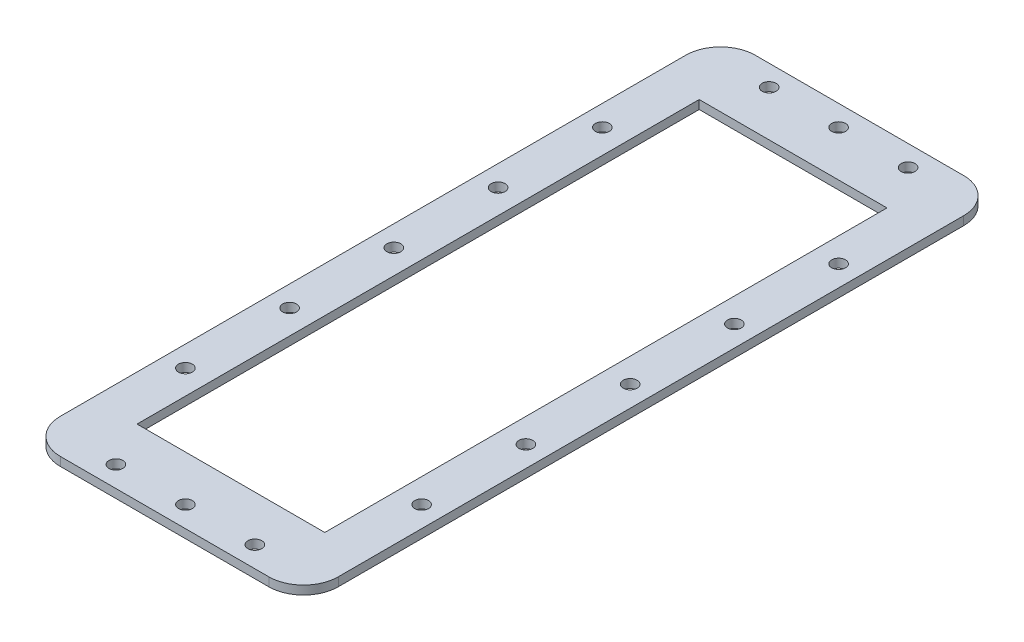
ISO-10303-21;
HEADER;
FILE_DESCRIPTION(('STEP AP214'),'2;1');
FILE_NAME('part.step','',(''),(''),'','','');
FILE_SCHEMA(('AUTOMOTIVE_DESIGN { 1 0 10303 214 1 1 1 1 }'));
ENDSEC;
DATA;
#1=APPLICATION_CONTEXT('core data for automotive mechanical design processes');
#2=APPLICATION_PROTOCOL_DEFINITION('international standard','automotive_design',2000,#1);
#3=PRODUCT_CONTEXT('',#1,'mechanical');
#4=PRODUCT('Part','Part','',(#3));
#5=PRODUCT_RELATED_PRODUCT_CATEGORY('part','',(#4));
#6=PRODUCT_DEFINITION_FORMATION('','',#4);
#7=PRODUCT_DEFINITION_CONTEXT('part definition',#1,'design');
#8=PRODUCT_DEFINITION('design','',#6,#7);
#9=PRODUCT_DEFINITION_SHAPE('','',#8);
#10=(LENGTH_UNIT() NAMED_UNIT(*) SI_UNIT(.MILLI.,.METRE.));
#11=(NAMED_UNIT(*) PLANE_ANGLE_UNIT() SI_UNIT($,.RADIAN.));
#12=(NAMED_UNIT(*) SI_UNIT($,.STERADIAN.) SOLID_ANGLE_UNIT());
#13=UNCERTAINTY_MEASURE_WITH_UNIT(LENGTH_MEASURE(1.E-05),#10,'distance_accuracy_value','');
#14=(GEOMETRIC_REPRESENTATION_CONTEXT(3) GLOBAL_UNCERTAINTY_ASSIGNED_CONTEXT((#13)) GLOBAL_UNIT_ASSIGNED_CONTEXT((#10,
#11,#12)) REPRESENTATION_CONTEXT('',''));
#15=CARTESIAN_POINT('',(0.,0.,0.));
#16=DIRECTION('',(0.,0.,1.));
#17=DIRECTION('',(1.,0.,0.));
#18=AXIS2_PLACEMENT_3D('',#15,#16,#17);
#19=CARTESIAN_POINT('',(-30.6996276411229,3.175,-42.9503076219948));
#20=DIRECTION('',(1.,0.,0.));
#21=DIRECTION('',(0.,0.,-1.));
#22=AXIS2_PLACEMENT_3D('',#19,#20,#21);
#23=PLANE('',#22);
#24=DIRECTION('',(0.,0.,1.));
#25=VECTOR('',#24,1.);
#26=CARTESIAN_POINT('',(-30.6996276411229,0.,-42.9503076219948));
#27=LINE('',#26,#25);
#28=CARTESIAN_POINT('',(-30.6996276411229,0.,-30.2503076219948));
#29=VERTEX_POINT('',#28);
#30=CARTESIAN_POINT('',(-30.6996276411228,0.,198.349692378005));
#31=VERTEX_POINT('',#30);
#32=EDGE_CURVE('E252',#29,#31,#27,.T.);
#33=ORIENTED_EDGE('',*,*,#32,.T.);
#34=DIRECTION('',(0.,-1.,0.));
#35=VECTOR('',#34,1.);
#36=CARTESIAN_POINT('',(-30.6996276411228,3.175,198.349692378005));
#37=LINE('',#36,#35);
#38=CARTESIAN_POINT('',(-30.6996276411228,3.175,198.349692378005));
#39=VERTEX_POINT('',#38);
#40=EDGE_CURVE('E294',#31,#39,#37,.F.);
#41=ORIENTED_EDGE('',*,*,#40,.T.);
#42=DIRECTION('',(0.,0.,1.));
#43=VECTOR('',#42,1.);
#44=CARTESIAN_POINT('',(-30.6996276411229,3.175,-42.9503076219948));
#45=LINE('',#44,#43);
#46=CARTESIAN_POINT('',(-30.6996276411229,3.175,-30.2503076219948));
#47=VERTEX_POINT('',#46);
#48=EDGE_CURVE('E255',#47,#39,#45,.T.);
#49=ORIENTED_EDGE('',*,*,#48,.F.);
#50=DIRECTION('',(0.,-1.,0.));
#51=VECTOR('',#50,1.);
#52=CARTESIAN_POINT('',(-30.6996276411229,3.175,-30.2503076219948));
#53=LINE('',#52,#51);
#54=EDGE_CURVE('E291',#47,#29,#53,.T.);
#55=ORIENTED_EDGE('',*,*,#54,.T.);
#56=EDGE_LOOP('',(#33,#41,#49,#55));
#57=FACE_BOUND('',#56,.T.);
#58=ADVANCED_FACE('F33',(#57),#23,.F.);
#59=CARTESIAN_POINT('',(-30.6996276411228,3.175,211.049692378005));
#60=DIRECTION('',(0.,0.,-1.));
#61=DIRECTION('',(-1.,0.,0.));
#62=AXIS2_PLACEMENT_3D('',#59,#60,#61);
#63=PLANE('',#62);
#64=DIRECTION('',(1.,0.,0.));
#65=VECTOR('',#64,1.);
#66=CARTESIAN_POINT('',(-30.6996276411228,3.175,211.049692378005));
#67=LINE('',#66,#65);
#68=CARTESIAN_POINT('',(-17.9996276411228,3.175,211.049692378005));
#69=VERTEX_POINT('',#68);
#70=CARTESIAN_POINT('',(58.2003723588771,3.175,211.049692378005));
#71=VERTEX_POINT('',#70);
#72=EDGE_CURVE('E258',#69,#71,#67,.T.);
#73=ORIENTED_EDGE('',*,*,#72,.F.);
#74=DIRECTION('',(0.,-1.,0.));
#75=VECTOR('',#74,1.);
#76=CARTESIAN_POINT('',(-17.9996276411228,3.175,211.049692378005));
#77=LINE('',#76,#75);
#78=CARTESIAN_POINT('',(-17.9996276411228,0.,211.049692378005));
#79=VERTEX_POINT('',#78);
#80=EDGE_CURVE('E280',#69,#79,#77,.T.);
#81=ORIENTED_EDGE('',*,*,#80,.T.);
#82=DIRECTION('',(1.,0.,0.));
#83=VECTOR('',#82,1.);
#84=CARTESIAN_POINT('',(-30.6996276411228,0.,211.049692378005));
#85=LINE('',#84,#83);
#86=CARTESIAN_POINT('',(58.2003723588771,0.,211.049692378005));
#87=VERTEX_POINT('',#86);
#88=EDGE_CURVE('E271',#79,#87,#85,.T.);
#89=ORIENTED_EDGE('',*,*,#88,.T.);
#90=DIRECTION('',(0.,-1.,0.));
#91=VECTOR('',#90,1.);
#92=CARTESIAN_POINT('',(58.2003723588771,3.175,211.049692378005));
#93=LINE('',#92,#91);
#94=EDGE_CURVE('E268',#87,#71,#93,.F.);
#95=ORIENTED_EDGE('',*,*,#94,.T.);
#96=EDGE_LOOP('',(#73,#81,#89,#95));
#97=FACE_BOUND('',#96,.T.);
#98=ADVANCED_FACE('F332',(#97),#63,.F.);
#99=CARTESIAN_POINT('',(70.9003723588771,3.175,-42.9503076219948));
#100=DIRECTION('',(-1.,0.,0.));
#101=DIRECTION('',(0.,0.,1.));
#102=AXIS2_PLACEMENT_3D('',#99,#100,#101);
#103=PLANE('',#102);
#104=DIRECTION('',(0.,0.,-1.));
#105=VECTOR('',#104,1.);
#106=CARTESIAN_POINT('',(70.9003723588771,3.175,-42.9503076219948));
#107=LINE('',#106,#105);
#108=CARTESIAN_POINT('',(70.9003723588771,3.175,198.349692378005));
#109=VERTEX_POINT('',#108);
#110=CARTESIAN_POINT('',(70.9003723588771,3.175,-30.2503076219948));
#111=VERTEX_POINT('',#110);
#112=EDGE_CURVE('E262',#109,#111,#107,.T.);
#113=ORIENTED_EDGE('',*,*,#112,.F.);
#114=DIRECTION('',(0.,-1.,0.));
#115=VECTOR('',#114,1.);
#116=CARTESIAN_POINT('',(70.9003723588771,3.175,198.349692378005));
#117=LINE('',#116,#115);
#118=CARTESIAN_POINT('',(70.9003723588771,0.,198.349692378005));
#119=VERTEX_POINT('',#118);
#120=EDGE_CURVE('E306',#109,#119,#117,.T.);
#121=ORIENTED_EDGE('',*,*,#120,.T.);
#122=DIRECTION('',(0.,0.,-1.));
#123=VECTOR('',#122,1.);
#124=CARTESIAN_POINT('',(70.9003723588771,0.,-42.9503076219948));
#125=LINE('',#124,#123);
#126=CARTESIAN_POINT('',(70.9003723588771,0.,-30.2503076219948));
#127=VERTEX_POINT('',#126);
#128=EDGE_CURVE('E274',#119,#127,#125,.T.);
#129=ORIENTED_EDGE('',*,*,#128,.T.);
#130=DIRECTION('',(0.,-1.,0.));
#131=VECTOR('',#130,1.);
#132=CARTESIAN_POINT('',(70.9003723588771,3.175,-30.2503076219948));
#133=LINE('',#132,#131);
#134=EDGE_CURVE('E304',#127,#111,#133,.F.);
#135=ORIENTED_EDGE('',*,*,#134,.T.);
#136=EDGE_LOOP('',(#113,#121,#129,#135));
#137=FACE_BOUND('',#136,.T.);
#138=ADVANCED_FACE('F341',(#137),#103,.F.);
#139=CARTESIAN_POINT('',(-30.6996276411229,3.175,-42.9503076219948));
#140=DIRECTION('',(0.,0.,1.));
#141=DIRECTION('',(1.,0.,0.));
#142=AXIS2_PLACEMENT_3D('',#139,#140,#141);
#143=PLANE('',#142);
#144=DIRECTION('',(-1.,0.,0.));
#145=VECTOR('',#144,1.);
#146=CARTESIAN_POINT('',(-30.6996276411229,3.175,-42.9503076219948));
#147=LINE('',#146,#145);
#148=CARTESIAN_POINT('',(58.2003723588771,3.175,-42.9503076219948));
#149=VERTEX_POINT('',#148);
#150=CARTESIAN_POINT('',(-17.9996276411229,3.175,-42.9503076219948));
#151=VERTEX_POINT('',#150);
#152=EDGE_CURVE('E265',#149,#151,#147,.T.);
#153=ORIENTED_EDGE('',*,*,#152,.F.);
#154=DIRECTION('',(0.,-1.,0.));
#155=VECTOR('',#154,1.);
#156=CARTESIAN_POINT('',(58.2003723588771,3.175,-42.9503076219948));
#157=LINE('',#156,#155);
#158=CARTESIAN_POINT('',(58.2003723588771,0.,-42.9503076219948));
#159=VERTEX_POINT('',#158);
#160=EDGE_CURVE('E11',#149,#159,#157,.T.);
#161=ORIENTED_EDGE('',*,*,#160,.T.);
#162=DIRECTION('',(-1.,0.,0.));
#163=VECTOR('',#162,1.);
#164=CARTESIAN_POINT('',(-30.6996276411229,0.,-42.9503076219948));
#165=LINE('',#164,#163);
#166=CARTESIAN_POINT('',(-17.9996276411229,0.,-42.9503076219948));
#167=VERTEX_POINT('',#166);
#168=EDGE_CURVE('E259',#159,#167,#165,.T.);
#169=ORIENTED_EDGE('',*,*,#168,.T.);
#170=DIRECTION('',(0.,-1.,0.));
#171=VECTOR('',#170,1.);
#172=CARTESIAN_POINT('',(-17.9996276411229,3.175,-42.9503076219948));
#173=LINE('',#172,#171);
#174=EDGE_CURVE('E41',#167,#151,#173,.F.);
#175=ORIENTED_EDGE('',*,*,#174,.T.);
#176=EDGE_LOOP('',(#153,#161,#169,#175));
#177=FACE_BOUND('',#176,.T.);
#178=ADVANCED_FACE('F311',(#177),#143,.F.);
#179=CARTESIAN_POINT('',(0.,3.175,0.));
#180=DIRECTION('',(0.,1.,0.));
#181=DIRECTION('',(0.,0.,1.));
#182=AXIS2_PLACEMENT_3D('',#179,#180,#181);
#183=PLANE('',#182);
#184=DIRECTION('',(0.,0.,-1.));
#185=VECTOR('',#184,1.);
#186=CARTESIAN_POINT('',(54.4160809992935,3.175,-18.6854897672288));
#187=LINE('',#186,#185);
#188=CARTESIAN_POINT('',(54.4160809992935,3.175,186.784874523239));
#189=VERTEX_POINT('',#188);
#190=CARTESIAN_POINT('',(54.4160809992935,3.175,-18.6854897672288));
#191=VERTEX_POINT('',#190);
#192=EDGE_CURVE('E48',#189,#191,#187,.T.);
#193=ORIENTED_EDGE('',*,*,#192,.F.);
#194=DIRECTION('',(1.,0.,0.));
#195=VECTOR('',#194,1.);
#196=CARTESIAN_POINT('',(-14.2153362815392,3.175,186.784874523239));
#197=LINE('',#196,#195);
#198=CARTESIAN_POINT('',(-14.2153362815392,3.175,186.784874523239));
#199=VERTEX_POINT('',#198);
#200=EDGE_CURVE('E140',#199,#189,#197,.T.);
#201=ORIENTED_EDGE('',*,*,#200,.F.);
#202=DIRECTION('',(0.,0.,1.));
#203=VECTOR('',#202,1.);
#204=CARTESIAN_POINT('',(-14.2153362815392,3.175,-18.6854897672288));
#205=LINE('',#204,#203);
#206=CARTESIAN_POINT('',(-14.2153362815392,3.175,-18.6854897672288));
#207=VERTEX_POINT('',#206);
#208=EDGE_CURVE('E143',#207,#199,#205,.T.);
#209=ORIENTED_EDGE('',*,*,#208,.F.);
#210=DIRECTION('',(-1.,0.,0.));
#211=VECTOR('',#210,1.);
#212=CARTESIAN_POINT('',(-14.2153362815392,3.175,-18.6854897672288));
#213=LINE('',#212,#211);
#214=EDGE_CURVE('E149',#191,#207,#213,.T.);
#215=ORIENTED_EDGE('',*,*,#214,.F.);
#216=EDGE_LOOP('',(#193,#201,#209,#215));
#217=FACE_BOUND('',#216,.T.);
#218=CARTESIAN_POINT('',(-5.29962764112285,3.175,203.429692378005));
#219=DIRECTION('',(0.,1.,0.));
#220=DIRECTION('',(0.,0.,-1.));
#221=AXIS2_PLACEMENT_3D('',#218,#219,#220);
#222=CIRCLE('',#221,2.54000000000001);
#223=CARTESIAN_POINT('',(-5.29962764112285,3.175,200.889692378005));
#224=VERTEX_POINT('',#223);
#225=EDGE_CURVE('E155',#224,#224,#222,.T.);
#226=ORIENTED_EDGE('',*,*,#225,.F.);
#227=EDGE_LOOP('',(#226));
#228=FACE_BOUND('',#227,.T.);
#229=CARTESIAN_POINT('',(20.1003723588771,3.175,203.429692378005));
#230=DIRECTION('',(0.,1.,0.));
#231=DIRECTION('',(0.,0.,-1.));
#232=AXIS2_PLACEMENT_3D('',#229,#230,#231);
#233=CIRCLE('',#232,2.54000000000001);
#234=CARTESIAN_POINT('',(20.1003723588771,3.175,200.889692378005));
#235=VERTEX_POINT('',#234);
#236=EDGE_CURVE('E241',#235,#235,#233,.T.);
#237=ORIENTED_EDGE('',*,*,#236,.F.);
#238=EDGE_LOOP('',(#237));
#239=FACE_BOUND('',#238,.T.);
#240=CARTESIAN_POINT('',(45.5003723588772,3.175,203.429692378005));
#241=DIRECTION('',(0.,1.,0.));
#242=DIRECTION('',(0.,0.,-1.));
#243=AXIS2_PLACEMENT_3D('',#240,#241,#242);
#244=CIRCLE('',#243,2.54000000000001);
#245=CARTESIAN_POINT('',(45.5003723588772,3.175,200.889692378005));
#246=VERTEX_POINT('',#245);
#247=EDGE_CURVE('E235',#246,#246,#244,.T.);
#248=ORIENTED_EDGE('',*,*,#247,.F.);
#249=EDGE_LOOP('',(#248));
#250=FACE_BOUND('',#249,.T.);
#251=CARTESIAN_POINT('',(-23.0796276411229,3.175,122.149692378005));
#252=DIRECTION('',(0.,1.,0.));
#253=DIRECTION('',(0.,0.,-1.));
#254=AXIS2_PLACEMENT_3D('',#251,#252,#253);
#255=CIRCLE('',#254,2.54);
#256=CARTESIAN_POINT('',(-23.0796276411229,3.175,119.609692378005));
#257=VERTEX_POINT('',#256);
#258=EDGE_CURVE('E229',#257,#257,#255,.T.);
#259=ORIENTED_EDGE('',*,*,#258,.F.);
#260=EDGE_LOOP('',(#259));
#261=FACE_BOUND('',#260,.T.);
#262=CARTESIAN_POINT('',(-23.0796276411229,3.175,160.249692378005));
#263=DIRECTION('',(0.,1.,0.));
#264=DIRECTION('',(0.,0.,-1.));
#265=AXIS2_PLACEMENT_3D('',#262,#263,#264);
#266=CIRCLE('',#265,2.54);
#267=CARTESIAN_POINT('',(-23.0796276411229,3.175,157.709692378005));
#268=VERTEX_POINT('',#267);
#269=EDGE_CURVE('E223',#268,#268,#266,.T.);
#270=ORIENTED_EDGE('',*,*,#269,.F.);
#271=EDGE_LOOP('',(#270));
#272=FACE_BOUND('',#271,.T.);
#273=CARTESIAN_POINT('',(63.2803723588772,3.175,160.249692378005));
#274=DIRECTION('',(0.,1.,0.));
#275=DIRECTION('',(0.,0.,1.));
#276=AXIS2_PLACEMENT_3D('',#273,#274,#275);
#277=CIRCLE('',#276,2.54);
#278=CARTESIAN_POINT('',(63.2803723588772,3.175,162.789692378005));
#279=VERTEX_POINT('',#278);
#280=EDGE_CURVE('E217',#279,#279,#277,.T.);
#281=ORIENTED_EDGE('',*,*,#280,.F.);
#282=EDGE_LOOP('',(#281));
#283=FACE_BOUND('',#282,.T.);
#284=CARTESIAN_POINT('',(63.2803723588771,3.175,122.149692378005));
#285=DIRECTION('',(0.,1.,0.));
#286=DIRECTION('',(0.,0.,1.));
#287=AXIS2_PLACEMENT_3D('',#284,#285,#286);
#288=CIRCLE('',#287,2.53999999999999);
#289=CARTESIAN_POINT('',(63.2803723588771,3.175,124.689692378005));
#290=VERTEX_POINT('',#289);
#291=EDGE_CURVE('E211',#290,#290,#288,.T.);
#292=ORIENTED_EDGE('',*,*,#291,.F.);
#293=EDGE_LOOP('',(#292));
#294=FACE_BOUND('',#293,.T.);
#295=CARTESIAN_POINT('',(20.1003723588771,3.175,-35.3303076219948));
#296=DIRECTION('',(0.,1.,0.));
#297=DIRECTION('',(0.,0.,1.));
#298=AXIS2_PLACEMENT_3D('',#295,#296,#297);
#299=CIRCLE('',#298,2.54);
#300=CARTESIAN_POINT('',(20.1003723588771,3.175,-32.7903076219948));
#301=VERTEX_POINT('',#300);
#302=EDGE_CURVE('E189',#301,#301,#299,.T.);
#303=ORIENTED_EDGE('',*,*,#302,.F.);
#304=EDGE_LOOP('',(#303));
#305=FACE_BOUND('',#304,.T.);
#306=CARTESIAN_POINT('',(45.5003723588771,3.175,-35.3303076219948));
#307=DIRECTION('',(0.,1.,0.));
#308=DIRECTION('',(0.,0.,1.));
#309=AXIS2_PLACEMENT_3D('',#306,#307,#308);
#310=CIRCLE('',#309,2.54);
#311=CARTESIAN_POINT('',(45.5003723588771,3.175,-32.7903076219948));
#312=VERTEX_POINT('',#311);
#313=EDGE_CURVE('E195',#312,#312,#310,.T.);
#314=ORIENTED_EDGE('',*,*,#313,.F.);
#315=EDGE_LOOP('',(#314));
#316=FACE_BOUND('',#315,.T.);
#317=CARTESIAN_POINT('',(-23.0796276411229,3.175,84.0496923780052));
#318=DIRECTION('',(0.,1.,0.));
#319=DIRECTION('',(0.,0.,1.));
#320=AXIS2_PLACEMENT_3D('',#317,#318,#319);
#321=CIRCLE('',#320,2.53999999999999);
#322=CARTESIAN_POINT('',(-23.0796276411229,3.175,86.5896923780052));
#323=VERTEX_POINT('',#322);
#324=EDGE_CURVE('E201',#323,#323,#321,.T.);
#325=ORIENTED_EDGE('',*,*,#324,.F.);
#326=EDGE_LOOP('',(#325));
#327=FACE_BOUND('',#326,.T.);
#328=CARTESIAN_POINT('',(-23.0796276411229,3.175,45.9496923780052));
#329=DIRECTION('',(0.,1.,0.));
#330=DIRECTION('',(0.,0.,1.));
#331=AXIS2_PLACEMENT_3D('',#328,#329,#330);
#332=CIRCLE('',#331,2.54);
#333=CARTESIAN_POINT('',(-23.0796276411229,3.175,48.4896923780052));
#334=VERTEX_POINT('',#333);
#335=EDGE_CURVE('E162',#334,#334,#332,.T.);
#336=ORIENTED_EDGE('',*,*,#335,.F.);
#337=EDGE_LOOP('',(#336));
#338=FACE_BOUND('',#337,.T.);
#339=CARTESIAN_POINT('',(-23.0796276411229,3.175,7.8496923780052));
#340=DIRECTION('',(0.,1.,0.));
#341=DIRECTION('',(0.,0.,1.));
#342=AXIS2_PLACEMENT_3D('',#339,#340,#341);
#343=CIRCLE('',#342,2.54);
#344=CARTESIAN_POINT('',(-23.0796276411229,3.175,10.3896923780052));
#345=VERTEX_POINT('',#344);
#346=EDGE_CURVE('E163',#345,#345,#343,.T.);
#347=ORIENTED_EDGE('',*,*,#346,.F.);
#348=EDGE_LOOP('',(#347));
#349=FACE_BOUND('',#348,.T.);
#350=CARTESIAN_POINT('',(63.2803723588771,3.175,7.84969237800519));
#351=DIRECTION('',(0.,1.,0.));
#352=DIRECTION('',(0.,0.,-1.));
#353=AXIS2_PLACEMENT_3D('',#350,#351,#352);
#354=CIRCLE('',#353,2.54);
#355=CARTESIAN_POINT('',(63.2803723588771,3.175,5.3096923780052));
#356=VERTEX_POINT('',#355);
#357=EDGE_CURVE('E169',#356,#356,#354,.T.);
#358=ORIENTED_EDGE('',*,*,#357,.F.);
#359=EDGE_LOOP('',(#358));
#360=FACE_BOUND('',#359,.T.);
#361=CARTESIAN_POINT('',(63.2803723588771,3.175,45.9496923780052));
#362=DIRECTION('',(0.,1.,0.));
#363=DIRECTION('',(0.,0.,-1.));
#364=AXIS2_PLACEMENT_3D('',#361,#362,#363);
#365=CIRCLE('',#364,2.54);
#366=CARTESIAN_POINT('',(63.2803723588771,3.175,43.4096923780052));
#367=VERTEX_POINT('',#366);
#368=EDGE_CURVE('E175',#367,#367,#365,.T.);
#369=ORIENTED_EDGE('',*,*,#368,.F.);
#370=EDGE_LOOP('',(#369));
#371=FACE_BOUND('',#370,.T.);
#372=CARTESIAN_POINT('',(63.2803723588771,3.175,84.0496923780052));
#373=DIRECTION('',(0.,1.,0.));
#374=DIRECTION('',(0.,0.,-1.));
#375=AXIS2_PLACEMENT_3D('',#372,#373,#374);
#376=CIRCLE('',#375,2.53999999999999);
#377=CARTESIAN_POINT('',(63.2803723588771,3.175,81.5096923780052));
#378=VERTEX_POINT('',#377);
#379=EDGE_CURVE('E181',#378,#378,#376,.T.);
#380=ORIENTED_EDGE('',*,*,#379,.F.);
#381=EDGE_LOOP('',(#380));
#382=FACE_BOUND('',#381,.T.);
#383=CARTESIAN_POINT('',(-5.29962764112289,3.175,-35.3303076219948));
#384=DIRECTION('',(0.,1.,0.));
#385=DIRECTION('',(0.,0.,1.));
#386=AXIS2_PLACEMENT_3D('',#383,#384,#385);
#387=CIRCLE('',#386,2.54);
#388=CARTESIAN_POINT('',(-5.29962764112289,3.175,-32.7903076219948));
#389=VERTEX_POINT('',#388);
#390=EDGE_CURVE('E188',#389,#389,#387,.T.);
#391=ORIENTED_EDGE('',*,*,#390,.F.);
#392=EDGE_LOOP('',(#391));
#393=FACE_BOUND('',#392,.T.);
#394=ORIENTED_EDGE('',*,*,#48,.T.);
#395=CARTESIAN_POINT('',(-17.9996276411228,3.175,198.349692378005));
#396=DIRECTION('',(0.,1.,0.));
#397=DIRECTION('',(0.,0.,1.));
#398=AXIS2_PLACEMENT_3D('',#395,#396,#397);
#399=CIRCLE('',#398,12.7);
#400=EDGE_CURVE('E302',#39,#69,#399,.T.);
#401=ORIENTED_EDGE('',*,*,#400,.T.);
#402=ORIENTED_EDGE('',*,*,#72,.T.);
#403=CARTESIAN_POINT('',(58.2003723588771,3.175,198.349692378005));
#404=DIRECTION('',(0.,1.,0.));
#405=DIRECTION('',(0.,0.,1.));
#406=AXIS2_PLACEMENT_3D('',#403,#404,#405);
#407=CIRCLE('',#406,12.7);
#408=EDGE_CURVE('E300',#71,#109,#407,.T.);
#409=ORIENTED_EDGE('',*,*,#408,.T.);
#410=ORIENTED_EDGE('',*,*,#112,.T.);
#411=CARTESIAN_POINT('',(58.2003723588771,3.175,-30.2503076219948));
#412=DIRECTION('',(0.,1.,0.));
#413=DIRECTION('',(0.,0.,1.));
#414=AXIS2_PLACEMENT_3D('',#411,#412,#413);
#415=CIRCLE('',#414,12.7);
#416=EDGE_CURVE('E298',#111,#149,#415,.T.);
#417=ORIENTED_EDGE('',*,*,#416,.T.);
#418=ORIENTED_EDGE('',*,*,#152,.T.);
#419=CARTESIAN_POINT('',(-17.9996276411229,3.175,-30.2503076219948));
#420=DIRECTION('',(0.,1.,0.));
#421=DIRECTION('',(0.,0.,1.));
#422=AXIS2_PLACEMENT_3D('',#419,#420,#421);
#423=CIRCLE('',#422,12.7);
#424=EDGE_CURVE('E296',#151,#47,#423,.T.);
#425=ORIENTED_EDGE('',*,*,#424,.T.);
#426=EDGE_LOOP('',(#394,#401,#402,#409,#410,#417,#418,#425));
#427=FACE_BOUND('',#426,.T.);
#428=ADVANCED_FACE('F317',(#217,#228,#239,#250,#261,#272,#283,#294,#305,#316,#327,#338,#349,
#360,#371,#382,#393,#427),#183,.T.);
#429=CARTESIAN_POINT('',(0.,0.,0.));
#430=DIRECTION('',(0.,1.,0.));
#431=DIRECTION('',(0.,0.,1.));
#432=AXIS2_PLACEMENT_3D('',#429,#430,#431);
#433=PLANE('',#432);
#434=DIRECTION('',(1.,0.,0.));
#435=VECTOR('',#434,1.);
#436=CARTESIAN_POINT('',(-14.2153362815392,0.,186.784874523239));
#437=LINE('',#436,#435);
#438=CARTESIAN_POINT('',(-14.2153362815392,0.,186.784874523239));
#439=VERTEX_POINT('',#438);
#440=CARTESIAN_POINT('',(54.4160809992935,0.,186.784874523239));
#441=VERTEX_POINT('',#440);
#442=EDGE_CURVE('E130',#439,#441,#437,.T.);
#443=ORIENTED_EDGE('',*,*,#442,.T.);
#444=DIRECTION('',(0.,0.,-1.));
#445=VECTOR('',#444,1.);
#446=CARTESIAN_POINT('',(54.4160809992935,0.,-18.6854897672288));
#447=LINE('',#446,#445);
#448=CARTESIAN_POINT('',(54.4160809992935,0.,-18.6854897672288));
#449=VERTEX_POINT('',#448);
#450=EDGE_CURVE('E124',#441,#449,#447,.T.);
#451=ORIENTED_EDGE('',*,*,#450,.T.);
#452=DIRECTION('',(-1.,0.,0.));
#453=VECTOR('',#452,1.);
#454=CARTESIAN_POINT('',(-14.2153362815392,0.,-18.6854897672288));
#455=LINE('',#454,#453);
#456=CARTESIAN_POINT('',(-14.2153362815392,0.,-18.6854897672288));
#457=VERTEX_POINT('',#456);
#458=EDGE_CURVE('E133',#449,#457,#455,.T.);
#459=ORIENTED_EDGE('',*,*,#458,.T.);
#460=DIRECTION('',(0.,0.,1.));
#461=VECTOR('',#460,1.);
#462=CARTESIAN_POINT('',(-14.2153362815392,0.,-18.6854897672288));
#463=LINE('',#462,#461);
#464=EDGE_CURVE('E56',#457,#439,#463,.T.);
#465=ORIENTED_EDGE('',*,*,#464,.T.);
#466=EDGE_LOOP('',(#443,#451,#459,#465));
#467=FACE_BOUND('',#466,.T.);
#468=CARTESIAN_POINT('',(-5.29962764112285,0.,203.429692378005));
#469=DIRECTION('',(0.,1.,0.));
#470=DIRECTION('',(0.,0.,-1.));
#471=AXIS2_PLACEMENT_3D('',#468,#469,#470);
#472=CIRCLE('',#471,2.54000000000001);
#473=CARTESIAN_POINT('',(-5.29962764112285,0.,200.889692378005));
#474=VERTEX_POINT('',#473);
#475=EDGE_CURVE('E244',#474,#474,#472,.T.);
#476=ORIENTED_EDGE('',*,*,#475,.T.);
#477=EDGE_LOOP('',(#476));
#478=FACE_BOUND('',#477,.T.);
#479=CARTESIAN_POINT('',(20.1003723588771,0.,203.429692378005));
#480=DIRECTION('',(0.,1.,0.));
#481=DIRECTION('',(0.,0.,-1.));
#482=AXIS2_PLACEMENT_3D('',#479,#480,#481);
#483=CIRCLE('',#482,2.54000000000001);
#484=CARTESIAN_POINT('',(20.1003723588771,0.,200.889692378005));
#485=VERTEX_POINT('',#484);
#486=EDGE_CURVE('E238',#485,#485,#483,.T.);
#487=ORIENTED_EDGE('',*,*,#486,.T.);
#488=EDGE_LOOP('',(#487));
#489=FACE_BOUND('',#488,.T.);
#490=CARTESIAN_POINT('',(45.5003723588772,0.,203.429692378005));
#491=DIRECTION('',(0.,1.,0.));
#492=DIRECTION('',(0.,0.,-1.));
#493=AXIS2_PLACEMENT_3D('',#490,#491,#492);
#494=CIRCLE('',#493,2.54000000000001);
#495=CARTESIAN_POINT('',(45.5003723588772,0.,200.889692378005));
#496=VERTEX_POINT('',#495);
#497=EDGE_CURVE('E232',#496,#496,#494,.T.);
#498=ORIENTED_EDGE('',*,*,#497,.T.);
#499=EDGE_LOOP('',(#498));
#500=FACE_BOUND('',#499,.T.);
#501=CARTESIAN_POINT('',(-23.0796276411229,0.,122.149692378005));
#502=DIRECTION('',(0.,1.,0.));
#503=DIRECTION('',(0.,0.,-1.));
#504=AXIS2_PLACEMENT_3D('',#501,#502,#503);
#505=CIRCLE('',#504,2.54);
#506=CARTESIAN_POINT('',(-23.0796276411229,0.,119.609692378005));
#507=VERTEX_POINT('',#506);
#508=EDGE_CURVE('E226',#507,#507,#505,.T.);
#509=ORIENTED_EDGE('',*,*,#508,.T.);
#510=EDGE_LOOP('',(#509));
#511=FACE_BOUND('',#510,.T.);
#512=CARTESIAN_POINT('',(-23.0796276411229,0.,160.249692378005));
#513=DIRECTION('',(0.,1.,0.));
#514=DIRECTION('',(0.,0.,-1.));
#515=AXIS2_PLACEMENT_3D('',#512,#513,#514);
#516=CIRCLE('',#515,2.54);
#517=CARTESIAN_POINT('',(-23.0796276411229,0.,157.709692378005));
#518=VERTEX_POINT('',#517);
#519=EDGE_CURVE('E220',#518,#518,#516,.T.);
#520=ORIENTED_EDGE('',*,*,#519,.T.);
#521=EDGE_LOOP('',(#520));
#522=FACE_BOUND('',#521,.T.);
#523=CARTESIAN_POINT('',(63.2803723588772,0.,160.249692378005));
#524=DIRECTION('',(0.,1.,0.));
#525=DIRECTION('',(0.,0.,1.));
#526=AXIS2_PLACEMENT_3D('',#523,#524,#525);
#527=CIRCLE('',#526,2.54);
#528=CARTESIAN_POINT('',(63.2803723588772,0.,162.789692378005));
#529=VERTEX_POINT('',#528);
#530=EDGE_CURVE('E214',#529,#529,#527,.T.);
#531=ORIENTED_EDGE('',*,*,#530,.T.);
#532=EDGE_LOOP('',(#531));
#533=FACE_BOUND('',#532,.T.);
#534=CARTESIAN_POINT('',(63.2803723588771,0.,122.149692378005));
#535=DIRECTION('',(0.,1.,0.));
#536=DIRECTION('',(0.,0.,1.));
#537=AXIS2_PLACEMENT_3D('',#534,#535,#536);
#538=CIRCLE('',#537,2.53999999999999);
#539=CARTESIAN_POINT('',(63.2803723588771,0.,124.689692378005));
#540=VERTEX_POINT('',#539);
#541=EDGE_CURVE('E184',#540,#540,#538,.T.);
#542=ORIENTED_EDGE('',*,*,#541,.T.);
#543=EDGE_LOOP('',(#542));
#544=FACE_BOUND('',#543,.T.);
#545=CARTESIAN_POINT('',(20.1003723588771,0.,-35.3303076219948));
#546=DIRECTION('',(0.,1.,0.));
#547=DIRECTION('',(0.,0.,1.));
#548=AXIS2_PLACEMENT_3D('',#545,#546,#547);
#549=CIRCLE('',#548,2.54);
#550=CARTESIAN_POINT('',(20.1003723588771,0.,-32.7903076219948));
#551=VERTEX_POINT('',#550);
#552=EDGE_CURVE('E185',#551,#551,#549,.T.);
#553=ORIENTED_EDGE('',*,*,#552,.T.);
#554=EDGE_LOOP('',(#553));
#555=FACE_BOUND('',#554,.T.);
#556=CARTESIAN_POINT('',(45.5003723588771,0.,-35.3303076219948));
#557=DIRECTION('',(0.,1.,0.));
#558=DIRECTION('',(0.,0.,1.));
#559=AXIS2_PLACEMENT_3D('',#556,#557,#558);
#560=CIRCLE('',#559,2.54);
#561=CARTESIAN_POINT('',(45.5003723588771,0.,-32.7903076219948));
#562=VERTEX_POINT('',#561);
#563=EDGE_CURVE('E192',#562,#562,#560,.T.);
#564=ORIENTED_EDGE('',*,*,#563,.T.);
#565=EDGE_LOOP('',(#564));
#566=FACE_BOUND('',#565,.T.);
#567=CARTESIAN_POINT('',(-23.0796276411229,0.,84.0496923780052));
#568=DIRECTION('',(0.,1.,0.));
#569=DIRECTION('',(0.,0.,1.));
#570=AXIS2_PLACEMENT_3D('',#567,#568,#569);
#571=CIRCLE('',#570,2.53999999999999);
#572=CARTESIAN_POINT('',(-23.0796276411229,0.,86.5896923780052));
#573=VERTEX_POINT('',#572);
#574=EDGE_CURVE('E198',#573,#573,#571,.T.);
#575=ORIENTED_EDGE('',*,*,#574,.T.);
#576=EDGE_LOOP('',(#575));
#577=FACE_BOUND('',#576,.T.);
#578=CARTESIAN_POINT('',(-23.0796276411229,0.,45.9496923780052));
#579=DIRECTION('',(0.,1.,0.));
#580=DIRECTION('',(0.,0.,1.));
#581=AXIS2_PLACEMENT_3D('',#578,#579,#580);
#582=CIRCLE('',#581,2.54);
#583=CARTESIAN_POINT('',(-23.0796276411229,0.,48.4896923780052));
#584=VERTEX_POINT('',#583);
#585=EDGE_CURVE('E204',#584,#584,#582,.T.);
#586=ORIENTED_EDGE('',*,*,#585,.T.);
#587=EDGE_LOOP('',(#586));
#588=FACE_BOUND('',#587,.T.);
#589=CARTESIAN_POINT('',(-23.0796276411229,0.,7.8496923780052));
#590=DIRECTION('',(0.,1.,0.));
#591=DIRECTION('',(0.,0.,1.));
#592=AXIS2_PLACEMENT_3D('',#589,#590,#591);
#593=CIRCLE('',#592,2.54);
#594=CARTESIAN_POINT('',(-23.0796276411229,0.,10.3896923780052));
#595=VERTEX_POINT('',#594);
#596=EDGE_CURVE('E159',#595,#595,#593,.T.);
#597=ORIENTED_EDGE('',*,*,#596,.T.);
#598=EDGE_LOOP('',(#597));
#599=FACE_BOUND('',#598,.T.);
#600=CARTESIAN_POINT('',(63.2803723588771,0.,7.84969237800519));
#601=DIRECTION('',(0.,1.,0.));
#602=DIRECTION('',(0.,0.,-1.));
#603=AXIS2_PLACEMENT_3D('',#600,#601,#602);
#604=CIRCLE('',#603,2.54);
#605=CARTESIAN_POINT('',(63.2803723588771,0.,5.3096923780052));
#606=VERTEX_POINT('',#605);
#607=EDGE_CURVE('E166',#606,#606,#604,.T.);
#608=ORIENTED_EDGE('',*,*,#607,.T.);
#609=EDGE_LOOP('',(#608));
#610=FACE_BOUND('',#609,.T.);
#611=CARTESIAN_POINT('',(63.2803723588771,0.,45.9496923780052));
#612=DIRECTION('',(0.,1.,0.));
#613=DIRECTION('',(0.,0.,-1.));
#614=AXIS2_PLACEMENT_3D('',#611,#612,#613);
#615=CIRCLE('',#614,2.54);
#616=CARTESIAN_POINT('',(63.2803723588771,0.,43.4096923780052));
#617=VERTEX_POINT('',#616);
#618=EDGE_CURVE('E172',#617,#617,#615,.T.);
#619=ORIENTED_EDGE('',*,*,#618,.T.);
#620=EDGE_LOOP('',(#619));
#621=FACE_BOUND('',#620,.T.);
#622=CARTESIAN_POINT('',(63.2803723588771,0.,84.0496923780052));
#623=DIRECTION('',(0.,1.,0.));
#624=DIRECTION('',(0.,0.,-1.));
#625=AXIS2_PLACEMENT_3D('',#622,#623,#624);
#626=CIRCLE('',#625,2.53999999999999);
#627=CARTESIAN_POINT('',(63.2803723588771,0.,81.5096923780052));
#628=VERTEX_POINT('',#627);
#629=EDGE_CURVE('E178',#628,#628,#626,.T.);
#630=ORIENTED_EDGE('',*,*,#629,.T.);
#631=EDGE_LOOP('',(#630));
#632=FACE_BOUND('',#631,.T.);
#633=CARTESIAN_POINT('',(-5.29962764112289,0.,-35.3303076219948));
#634=DIRECTION('',(0.,1.,0.));
#635=DIRECTION('',(0.,0.,1.));
#636=AXIS2_PLACEMENT_3D('',#633,#634,#635);
#637=CIRCLE('',#636,2.54);
#638=CARTESIAN_POINT('',(-5.29962764112289,0.,-32.7903076219948));
#639=VERTEX_POINT('',#638);
#640=EDGE_CURVE('E249',#639,#639,#637,.T.);
#641=ORIENTED_EDGE('',*,*,#640,.T.);
#642=EDGE_LOOP('',(#641));
#643=FACE_BOUND('',#642,.T.);
#644=ORIENTED_EDGE('',*,*,#88,.F.);
#645=CARTESIAN_POINT('',(-17.9996276411228,0.,198.349692378005));
#646=DIRECTION('',(0.,1.,0.));
#647=DIRECTION('',(0.,0.,1.));
#648=AXIS2_PLACEMENT_3D('',#645,#646,#647);
#649=CIRCLE('',#648,12.7);
#650=EDGE_CURVE('E289',#79,#31,#649,.F.);
#651=ORIENTED_EDGE('',*,*,#650,.T.);
#652=ORIENTED_EDGE('',*,*,#32,.F.);
#653=CARTESIAN_POINT('',(-17.9996276411229,0.,-30.2503076219948));
#654=DIRECTION('',(0.,1.,0.));
#655=DIRECTION('',(0.,0.,1.));
#656=AXIS2_PLACEMENT_3D('',#653,#654,#655);
#657=CIRCLE('',#656,12.7);
#658=EDGE_CURVE('E283',#29,#167,#657,.F.);
#659=ORIENTED_EDGE('',*,*,#658,.T.);
#660=ORIENTED_EDGE('',*,*,#168,.F.);
#661=CARTESIAN_POINT('',(58.2003723588771,0.,-30.2503076219948));
#662=DIRECTION('',(0.,1.,0.));
#663=DIRECTION('',(0.,0.,1.));
#664=AXIS2_PLACEMENT_3D('',#661,#662,#663);
#665=CIRCLE('',#664,12.7);
#666=EDGE_CURVE('E285',#159,#127,#665,.F.);
#667=ORIENTED_EDGE('',*,*,#666,.T.);
#668=ORIENTED_EDGE('',*,*,#128,.F.);
#669=CARTESIAN_POINT('',(58.2003723588771,0.,198.349692378005));
#670=DIRECTION('',(0.,1.,0.));
#671=DIRECTION('',(0.,0.,1.));
#672=AXIS2_PLACEMENT_3D('',#669,#670,#671);
#673=CIRCLE('',#672,12.7);
#674=EDGE_CURVE('E287',#119,#87,#673,.F.);
#675=ORIENTED_EDGE('',*,*,#674,.T.);
#676=EDGE_LOOP('',(#644,#651,#652,#659,#660,#667,#668,#675));
#677=FACE_BOUND('',#676,.T.);
#678=ADVANCED_FACE('F137',(#467,#478,#489,#500,#511,#522,#533,#544,#555,#566,#577,#588,#599,
#610,#621,#632,#643,#677),#433,.F.);
#679=CARTESIAN_POINT('',(-5.29962764112289,0.,-35.3303076219948));
#680=DIRECTION('',(0.,1.,0.));
#681=DIRECTION('',(0.,0.,1.));
#682=AXIS2_PLACEMENT_3D('',#679,#680,#681);
#683=CYLINDRICAL_SURFACE('',#682,2.54);
#684=ORIENTED_EDGE('',*,*,#640,.F.);
#685=EDGE_LOOP('',(#684));
#686=FACE_BOUND('',#685,.T.);
#687=ORIENTED_EDGE('',*,*,#390,.T.);
#688=EDGE_LOOP('',(#687));
#689=FACE_BOUND('',#688,.T.);
#690=ADVANCED_FACE('F377',(#686,#689),#683,.F.);
#691=CARTESIAN_POINT('',(63.2803723588771,0.,84.0496923780052));
#692=DIRECTION('',(0.,1.,0.));
#693=DIRECTION('',(0.,0.,1.));
#694=AXIS2_PLACEMENT_3D('',#691,#692,#693);
#695=CYLINDRICAL_SURFACE('',#694,2.53999999999999);
#696=ORIENTED_EDGE('',*,*,#629,.F.);
#697=EDGE_LOOP('',(#696));
#698=FACE_BOUND('',#697,.T.);
#699=ORIENTED_EDGE('',*,*,#379,.T.);
#700=EDGE_LOOP('',(#699));
#701=FACE_BOUND('',#700,.T.);
#702=ADVANCED_FACE('F380',(#698,#701),#695,.F.);
#703=CARTESIAN_POINT('',(63.2803723588771,0.,45.9496923780052));
#704=DIRECTION('',(0.,1.,0.));
#705=DIRECTION('',(0.,0.,1.));
#706=AXIS2_PLACEMENT_3D('',#703,#704,#705);
#707=CYLINDRICAL_SURFACE('',#706,2.54);
#708=ORIENTED_EDGE('',*,*,#618,.F.);
#709=EDGE_LOOP('',(#708));
#710=FACE_BOUND('',#709,.T.);
#711=ORIENTED_EDGE('',*,*,#368,.T.);
#712=EDGE_LOOP('',(#711));
#713=FACE_BOUND('',#712,.T.);
#714=ADVANCED_FACE('F421',(#710,#713),#707,.F.);
#715=CARTESIAN_POINT('',(63.2803723588771,0.,7.84969237800519));
#716=DIRECTION('',(0.,1.,0.));
#717=DIRECTION('',(0.,0.,1.));
#718=AXIS2_PLACEMENT_3D('',#715,#716,#717);
#719=CYLINDRICAL_SURFACE('',#718,2.54);
#720=ORIENTED_EDGE('',*,*,#607,.F.);
#721=EDGE_LOOP('',(#720));
#722=FACE_BOUND('',#721,.T.);
#723=ORIENTED_EDGE('',*,*,#357,.T.);
#724=EDGE_LOOP('',(#723));
#725=FACE_BOUND('',#724,.T.);
#726=ADVANCED_FACE('F429',(#722,#725),#719,.F.);
#727=CARTESIAN_POINT('',(-23.0796276411229,0.,7.8496923780052));
#728=DIRECTION('',(0.,1.,0.));
#729=DIRECTION('',(0.,0.,1.));
#730=AXIS2_PLACEMENT_3D('',#727,#728,#729);
#731=CYLINDRICAL_SURFACE('',#730,2.54);
#732=ORIENTED_EDGE('',*,*,#596,.F.);
#733=EDGE_LOOP('',(#732));
#734=FACE_BOUND('',#733,.T.);
#735=ORIENTED_EDGE('',*,*,#346,.T.);
#736=EDGE_LOOP('',(#735));
#737=FACE_BOUND('',#736,.T.);
#738=ADVANCED_FACE('F437',(#734,#737),#731,.F.);
#739=CARTESIAN_POINT('',(-23.0796276411229,0.,45.9496923780052));
#740=DIRECTION('',(0.,1.,0.));
#741=DIRECTION('',(0.,0.,1.));
#742=AXIS2_PLACEMENT_3D('',#739,#740,#741);
#743=CYLINDRICAL_SURFACE('',#742,2.54);
#744=ORIENTED_EDGE('',*,*,#585,.F.);
#745=EDGE_LOOP('',(#744));
#746=FACE_BOUND('',#745,.T.);
#747=ORIENTED_EDGE('',*,*,#335,.T.);
#748=EDGE_LOOP('',(#747));
#749=FACE_BOUND('',#748,.T.);
#750=ADVANCED_FACE('F445',(#746,#749),#743,.F.);
#751=CARTESIAN_POINT('',(-23.0796276411229,0.,84.0496923780052));
#752=DIRECTION('',(0.,1.,0.));
#753=DIRECTION('',(0.,0.,1.));
#754=AXIS2_PLACEMENT_3D('',#751,#752,#753);
#755=CYLINDRICAL_SURFACE('',#754,2.53999999999999);
#756=ORIENTED_EDGE('',*,*,#574,.F.);
#757=EDGE_LOOP('',(#756));
#758=FACE_BOUND('',#757,.T.);
#759=ORIENTED_EDGE('',*,*,#324,.T.);
#760=EDGE_LOOP('',(#759));
#761=FACE_BOUND('',#760,.T.);
#762=ADVANCED_FACE('F453',(#758,#761),#755,.F.);
#763=CARTESIAN_POINT('',(45.5003723588771,0.,-35.3303076219948));
#764=DIRECTION('',(0.,1.,0.));
#765=DIRECTION('',(0.,0.,1.));
#766=AXIS2_PLACEMENT_3D('',#763,#764,#765);
#767=CYLINDRICAL_SURFACE('',#766,2.54);
#768=ORIENTED_EDGE('',*,*,#563,.F.);
#769=EDGE_LOOP('',(#768));
#770=FACE_BOUND('',#769,.T.);
#771=ORIENTED_EDGE('',*,*,#313,.T.);
#772=EDGE_LOOP('',(#771));
#773=FACE_BOUND('',#772,.T.);
#774=ADVANCED_FACE('F461',(#770,#773),#767,.F.);
#775=CARTESIAN_POINT('',(20.1003723588771,0.,-35.3303076219948));
#776=DIRECTION('',(0.,1.,0.));
#777=DIRECTION('',(0.,0.,1.));
#778=AXIS2_PLACEMENT_3D('',#775,#776,#777);
#779=CYLINDRICAL_SURFACE('',#778,2.54);
#780=ORIENTED_EDGE('',*,*,#552,.F.);
#781=EDGE_LOOP('',(#780));
#782=FACE_BOUND('',#781,.T.);
#783=ORIENTED_EDGE('',*,*,#302,.T.);
#784=EDGE_LOOP('',(#783));
#785=FACE_BOUND('',#784,.T.);
#786=ADVANCED_FACE('F469',(#782,#785),#779,.F.);
#787=CARTESIAN_POINT('',(63.2803723588771,0.,122.149692378005));
#788=DIRECTION('',(0.,1.,0.));
#789=DIRECTION('',(0.,0.,1.));
#790=AXIS2_PLACEMENT_3D('',#787,#788,#789);
#791=CYLINDRICAL_SURFACE('',#790,2.53999999999999);
#792=ORIENTED_EDGE('',*,*,#541,.F.);
#793=EDGE_LOOP('',(#792));
#794=FACE_BOUND('',#793,.T.);
#795=ORIENTED_EDGE('',*,*,#291,.T.);
#796=EDGE_LOOP('',(#795));
#797=FACE_BOUND('',#796,.T.);
#798=ADVANCED_FACE('F477',(#794,#797),#791,.F.);
#799=CARTESIAN_POINT('',(63.2803723588772,0.,160.249692378005));
#800=DIRECTION('',(0.,1.,0.));
#801=DIRECTION('',(0.,0.,1.));
#802=AXIS2_PLACEMENT_3D('',#799,#800,#801);
#803=CYLINDRICAL_SURFACE('',#802,2.54);
#804=ORIENTED_EDGE('',*,*,#530,.F.);
#805=EDGE_LOOP('',(#804));
#806=FACE_BOUND('',#805,.T.);
#807=ORIENTED_EDGE('',*,*,#280,.T.);
#808=EDGE_LOOP('',(#807));
#809=FACE_BOUND('',#808,.T.);
#810=ADVANCED_FACE('F485',(#806,#809),#803,.F.);
#811=CARTESIAN_POINT('',(-23.0796276411229,0.,160.249692378005));
#812=DIRECTION('',(0.,1.,0.));
#813=DIRECTION('',(0.,0.,1.));
#814=AXIS2_PLACEMENT_3D('',#811,#812,#813);
#815=CYLINDRICAL_SURFACE('',#814,2.54);
#816=ORIENTED_EDGE('',*,*,#519,.F.);
#817=EDGE_LOOP('',(#816));
#818=FACE_BOUND('',#817,.T.);
#819=ORIENTED_EDGE('',*,*,#269,.T.);
#820=EDGE_LOOP('',(#819));
#821=FACE_BOUND('',#820,.T.);
#822=ADVANCED_FACE('F493',(#818,#821),#815,.F.);
#823=CARTESIAN_POINT('',(-23.0796276411229,0.,122.149692378005));
#824=DIRECTION('',(0.,1.,0.));
#825=DIRECTION('',(0.,0.,1.));
#826=AXIS2_PLACEMENT_3D('',#823,#824,#825);
#827=CYLINDRICAL_SURFACE('',#826,2.54);
#828=ORIENTED_EDGE('',*,*,#508,.F.);
#829=EDGE_LOOP('',(#828));
#830=FACE_BOUND('',#829,.T.);
#831=ORIENTED_EDGE('',*,*,#258,.T.);
#832=EDGE_LOOP('',(#831));
#833=FACE_BOUND('',#832,.T.);
#834=ADVANCED_FACE('F501',(#830,#833),#827,.F.);
#835=CARTESIAN_POINT('',(45.5003723588772,0.,203.429692378005));
#836=DIRECTION('',(0.,1.,0.));
#837=DIRECTION('',(0.,0.,1.));
#838=AXIS2_PLACEMENT_3D('',#835,#836,#837);
#839=CYLINDRICAL_SURFACE('',#838,2.54000000000001);
#840=ORIENTED_EDGE('',*,*,#497,.F.);
#841=EDGE_LOOP('',(#840));
#842=FACE_BOUND('',#841,.T.);
#843=ORIENTED_EDGE('',*,*,#247,.T.);
#844=EDGE_LOOP('',(#843));
#845=FACE_BOUND('',#844,.T.);
#846=ADVANCED_FACE('F370',(#842,#845),#839,.F.);
#847=CARTESIAN_POINT('',(20.1003723588771,0.,203.429692378005));
#848=DIRECTION('',(0.,1.,0.));
#849=DIRECTION('',(0.,0.,1.));
#850=AXIS2_PLACEMENT_3D('',#847,#848,#849);
#851=CYLINDRICAL_SURFACE('',#850,2.54000000000001);
#852=ORIENTED_EDGE('',*,*,#486,.F.);
#853=EDGE_LOOP('',(#852));
#854=FACE_BOUND('',#853,.T.);
#855=ORIENTED_EDGE('',*,*,#236,.T.);
#856=EDGE_LOOP('',(#855));
#857=FACE_BOUND('',#856,.T.);
#858=ADVANCED_FACE('F364',(#854,#857),#851,.F.);
#859=CARTESIAN_POINT('',(-5.29962764112285,0.,203.429692378005));
#860=DIRECTION('',(0.,1.,0.));
#861=DIRECTION('',(0.,0.,1.));
#862=AXIS2_PLACEMENT_3D('',#859,#860,#861);
#863=CYLINDRICAL_SURFACE('',#862,2.54000000000001);
#864=ORIENTED_EDGE('',*,*,#475,.F.);
#865=EDGE_LOOP('',(#864));
#866=FACE_BOUND('',#865,.T.);
#867=ORIENTED_EDGE('',*,*,#225,.T.);
#868=EDGE_LOOP('',(#867));
#869=FACE_BOUND('',#868,.T.);
#870=ADVANCED_FACE('F360',(#866,#869),#863,.F.);
#871=CARTESIAN_POINT('',(-17.9996276411228,3.175,198.349692378005));
#872=DIRECTION('',(0.,-1.,0.));
#873=DIRECTION('',(0.,0.,-1.));
#874=AXIS2_PLACEMENT_3D('',#871,#872,#873);
#875=CYLINDRICAL_SURFACE('',#874,12.7);
#876=ORIENTED_EDGE('',*,*,#400,.F.);
#877=ORIENTED_EDGE('',*,*,#40,.F.);
#878=ORIENTED_EDGE('',*,*,#650,.F.);
#879=ORIENTED_EDGE('',*,*,#80,.F.);
#880=EDGE_LOOP('',(#876,#877,#878,#879));
#881=FACE_BOUND('',#880,.T.);
#882=ADVANCED_FACE('F329',(#881),#875,.T.);
#883=CARTESIAN_POINT('',(58.2003723588771,3.175,198.349692378005));
#884=DIRECTION('',(0.,-1.,0.));
#885=DIRECTION('',(0.,0.,-1.));
#886=AXIS2_PLACEMENT_3D('',#883,#884,#885);
#887=CYLINDRICAL_SURFACE('',#886,12.7);
#888=ORIENTED_EDGE('',*,*,#408,.F.);
#889=ORIENTED_EDGE('',*,*,#94,.F.);
#890=ORIENTED_EDGE('',*,*,#674,.F.);
#891=ORIENTED_EDGE('',*,*,#120,.F.);
#892=EDGE_LOOP('',(#888,#889,#890,#891));
#893=FACE_BOUND('',#892,.T.);
#894=ADVANCED_FACE('F338',(#893),#887,.T.);
#895=CARTESIAN_POINT('',(58.2003723588771,3.175,-30.2503076219948));
#896=DIRECTION('',(0.,-1.,0.));
#897=DIRECTION('',(0.,0.,-1.));
#898=AXIS2_PLACEMENT_3D('',#895,#896,#897);
#899=CYLINDRICAL_SURFACE('',#898,12.7);
#900=ORIENTED_EDGE('',*,*,#416,.F.);
#901=ORIENTED_EDGE('',*,*,#134,.F.);
#902=ORIENTED_EDGE('',*,*,#666,.F.);
#903=ORIENTED_EDGE('',*,*,#160,.F.);
#904=EDGE_LOOP('',(#900,#901,#902,#903));
#905=FACE_BOUND('',#904,.T.);
#906=ADVANCED_FACE('F344',(#905),#899,.T.);
#907=CARTESIAN_POINT('',(-17.9996276411229,3.175,-30.2503076219948));
#908=DIRECTION('',(0.,-1.,0.));
#909=DIRECTION('',(0.,0.,-1.));
#910=AXIS2_PLACEMENT_3D('',#907,#908,#909);
#911=CYLINDRICAL_SURFACE('',#910,12.7);
#912=ORIENTED_EDGE('',*,*,#424,.F.);
#913=ORIENTED_EDGE('',*,*,#174,.F.);
#914=ORIENTED_EDGE('',*,*,#658,.F.);
#915=ORIENTED_EDGE('',*,*,#54,.F.);
#916=EDGE_LOOP('',(#912,#913,#914,#915));
#917=FACE_BOUND('',#916,.T.);
#918=ADVANCED_FACE('F35',(#917),#911,.T.);
#919=CARTESIAN_POINT('',(54.4160809992935,0.,-18.6854897672288));
#920=DIRECTION('',(1.,0.,0.));
#921=DIRECTION('',(0.,0.,-1.));
#922=AXIS2_PLACEMENT_3D('',#919,#920,#921);
#923=PLANE('',#922);
#924=ORIENTED_EDGE('',*,*,#192,.T.);
#925=DIRECTION('',(0.,1.,0.));
#926=VECTOR('',#925,1.);
#927=CARTESIAN_POINT('',(54.4160809992935,0.,-18.6854897672288));
#928=LINE('',#927,#926);
#929=EDGE_CURVE('E120',#449,#191,#928,.T.);
#930=ORIENTED_EDGE('',*,*,#929,.F.);
#931=ORIENTED_EDGE('',*,*,#450,.F.);
#932=DIRECTION('',(0.,1.,0.));
#933=VECTOR('',#932,1.);
#934=CARTESIAN_POINT('',(54.4160809992935,0.,186.784874523239));
#935=LINE('',#934,#933);
#936=EDGE_CURVE('E153',#441,#189,#935,.T.);
#937=ORIENTED_EDGE('',*,*,#936,.T.);
#938=EDGE_LOOP('',(#924,#930,#931,#937));
#939=FACE_BOUND('',#938,.T.);
#940=ADVANCED_FACE('F122',(#939),#923,.F.);
#941=CARTESIAN_POINT('',(-14.2153362815392,0.,186.784874523239));
#942=DIRECTION('',(0.,0.,1.));
#943=DIRECTION('',(1.,0.,0.));
#944=AXIS2_PLACEMENT_3D('',#941,#942,#943);
#945=PLANE('',#944);
#946=ORIENTED_EDGE('',*,*,#200,.T.);
#947=ORIENTED_EDGE('',*,*,#936,.F.);
#948=ORIENTED_EDGE('',*,*,#442,.F.);
#949=DIRECTION('',(0.,1.,0.));
#950=VECTOR('',#949,1.);
#951=CARTESIAN_POINT('',(-14.2153362815392,0.,186.784874523239));
#952=LINE('',#951,#950);
#953=EDGE_CURVE('E156',#439,#199,#952,.T.);
#954=ORIENTED_EDGE('',*,*,#953,.T.);
#955=EDGE_LOOP('',(#946,#947,#948,#954));
#956=FACE_BOUND('',#955,.T.);
#957=ADVANCED_FACE('F562',(#956),#945,.F.);
#958=CARTESIAN_POINT('',(-14.2153362815392,0.,-18.6854897672288));
#959=DIRECTION('',(-1.,0.,0.));
#960=DIRECTION('',(0.,0.,1.));
#961=AXIS2_PLACEMENT_3D('',#958,#959,#960);
#962=PLANE('',#961);
#963=ORIENTED_EDGE('',*,*,#208,.T.);
#964=ORIENTED_EDGE('',*,*,#953,.F.);
#965=ORIENTED_EDGE('',*,*,#464,.F.);
#966=DIRECTION('',(0.,1.,0.));
#967=VECTOR('',#966,1.);
#968=CARTESIAN_POINT('',(-14.2153362815392,0.,-18.6854897672288));
#969=LINE('',#968,#967);
#970=EDGE_CURVE('E129',#457,#207,#969,.T.);
#971=ORIENTED_EDGE('',*,*,#970,.T.);
#972=EDGE_LOOP('',(#963,#964,#965,#971));
#973=FACE_BOUND('',#972,.T.);
#974=ADVANCED_FACE('F570',(#973),#962,.F.);
#975=CARTESIAN_POINT('',(-14.2153362815392,0.,-18.6854897672288));
#976=DIRECTION('',(0.,0.,-1.));
#977=DIRECTION('',(-1.,0.,0.));
#978=AXIS2_PLACEMENT_3D('',#975,#976,#977);
#979=PLANE('',#978);
#980=ORIENTED_EDGE('',*,*,#214,.T.);
#981=ORIENTED_EDGE('',*,*,#970,.F.);
#982=ORIENTED_EDGE('',*,*,#458,.F.);
#983=ORIENTED_EDGE('',*,*,#929,.T.);
#984=EDGE_LOOP('',(#980,#981,#982,#983));
#985=FACE_BOUND('',#984,.T.);
#986=ADVANCED_FACE('F134',(#985),#979,.F.);
#987=CLOSED_SHELL('',(#58,#98,#138,#178,#428,#678,#690,#702,#714,#726,#738,#750,#762,#774,#786,
#798,#810,#822,#834,#846,#858,#870,#882,#894,#906,#918,#940,#957,#974,#986));
#988=MANIFOLD_SOLID_BREP('B2',#987);
#989=ADVANCED_BREP_SHAPE_REPRESENTATION('',(#18,#988),#14);
#990=SHAPE_DEFINITION_REPRESENTATION(#9,#989);
ENDSEC;
END-ISO-10303-21;
